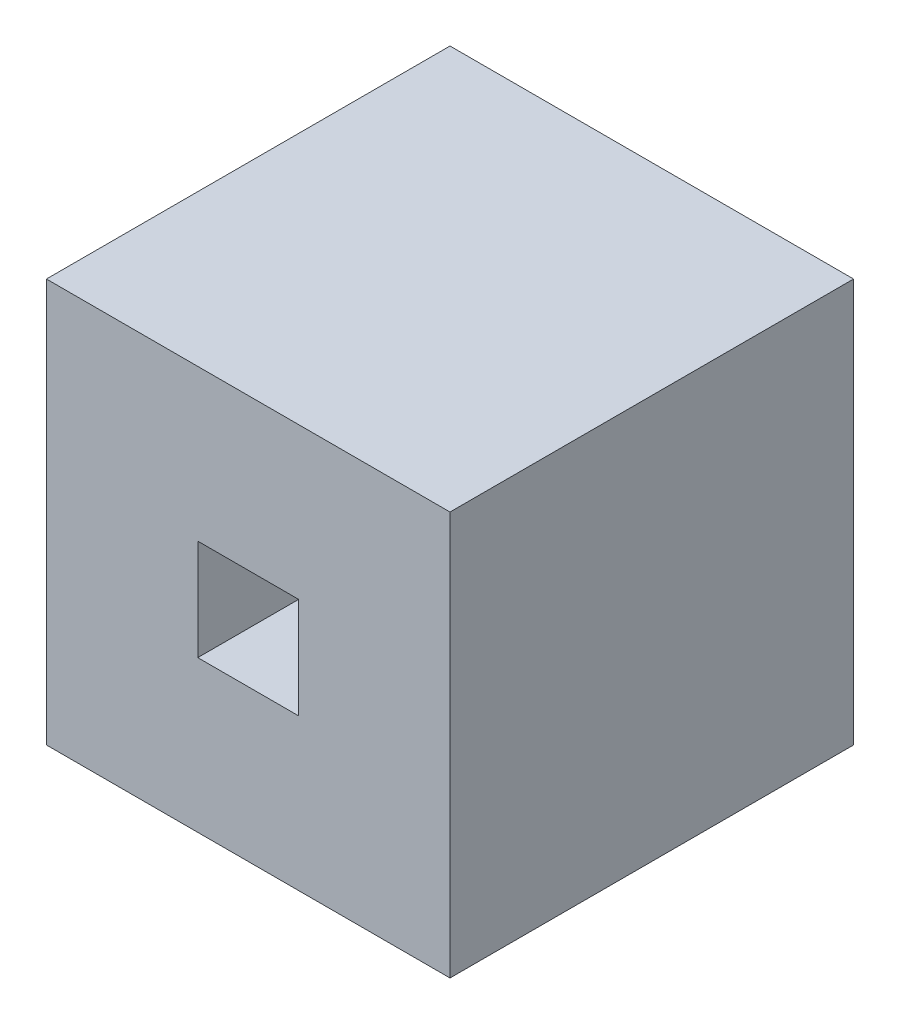
ISO-10303-21;
HEADER;
FILE_DESCRIPTION(('STEP AP214'),'2;1');
FILE_NAME('part.step','',(''),(''),'','','');
FILE_SCHEMA(('AUTOMOTIVE_DESIGN { 1 0 10303 214 1 1 1 1 }'));
ENDSEC;
DATA;
#1=APPLICATION_CONTEXT('core data for automotive mechanical design processes');
#2=APPLICATION_PROTOCOL_DEFINITION('international standard','automotive_design',2000,#1);
#3=PRODUCT_CONTEXT('',#1,'mechanical');
#4=PRODUCT('Part','Part','',(#3));
#5=PRODUCT_RELATED_PRODUCT_CATEGORY('part','',(#4));
#6=PRODUCT_DEFINITION_FORMATION('','',#4);
#7=PRODUCT_DEFINITION_CONTEXT('part definition',#1,'design');
#8=PRODUCT_DEFINITION('design','',#6,#7);
#9=PRODUCT_DEFINITION_SHAPE('','',#8);
#10=(LENGTH_UNIT() NAMED_UNIT(*) SI_UNIT(.MILLI.,.METRE.));
#11=(NAMED_UNIT(*) PLANE_ANGLE_UNIT() SI_UNIT($,.RADIAN.));
#12=(NAMED_UNIT(*) SI_UNIT($,.STERADIAN.) SOLID_ANGLE_UNIT());
#13=UNCERTAINTY_MEASURE_WITH_UNIT(LENGTH_MEASURE(1.E-05),#10,'distance_accuracy_value','');
#14=(GEOMETRIC_REPRESENTATION_CONTEXT(3) GLOBAL_UNCERTAINTY_ASSIGNED_CONTEXT((#13)) GLOBAL_UNIT_ASSIGNED_CONTEXT((#10,
#11,#12)) REPRESENTATION_CONTEXT('',''));
#15=CARTESIAN_POINT('',(0.,0.,0.));
#16=DIRECTION('',(0.,0.,1.));
#17=DIRECTION('',(1.,0.,0.));
#18=AXIS2_PLACEMENT_3D('',#15,#16,#17);
#19=CARTESIAN_POINT('',(-0.3,0.3,2.4));
#20=DIRECTION('',(-1.,0.,0.));
#21=DIRECTION('',(0.,0.,1.));
#22=AXIS2_PLACEMENT_3D('',#19,#20,#21);
#23=PLANE('',#22);
#24=DIRECTION('',(0.,0.,-1.));
#25=VECTOR('',#24,1.);
#26=CARTESIAN_POINT('',(-0.3,0.3,2.4));
#27=LINE('',#26,#25);
#28=CARTESIAN_POINT('',(-0.3,0.3,2.4));
#29=VERTEX_POINT('',#28);
#30=CARTESIAN_POINT('',(-0.3,0.3,0.));
#31=VERTEX_POINT('',#30);
#32=EDGE_CURVE('E11',#29,#31,#27,.T.);
#33=ORIENTED_EDGE('',*,*,#32,.F.);
#34=DIRECTION('',(0.,-1.,0.));
#35=VECTOR('',#34,1.);
#36=CARTESIAN_POINT('',(-0.3,0.3,2.4));
#37=LINE('',#36,#35);
#38=CARTESIAN_POINT('',(-0.3,-0.3,2.4));
#39=VERTEX_POINT('',#38);
#40=EDGE_CURVE('E110',#29,#39,#37,.T.);
#41=ORIENTED_EDGE('',*,*,#40,.T.);
#42=DIRECTION('',(0.,0.,-1.));
#43=VECTOR('',#42,1.);
#44=CARTESIAN_POINT('',(-0.3,-0.3,2.4));
#45=LINE('',#44,#43);
#46=CARTESIAN_POINT('',(-0.3,-0.3,0.));
#47=VERTEX_POINT('',#46);
#48=EDGE_CURVE('E182',#39,#47,#45,.T.);
#49=ORIENTED_EDGE('',*,*,#48,.T.);
#50=DIRECTION('',(0.,-1.,0.));
#51=VECTOR('',#50,1.);
#52=CARTESIAN_POINT('',(-0.3,0.3,0.));
#53=LINE('',#52,#51);
#54=EDGE_CURVE('E136',#31,#47,#53,.T.);
#55=ORIENTED_EDGE('',*,*,#54,.F.);
#56=EDGE_LOOP('',(#33,#41,#49,#55));
#57=FACE_BOUND('',#56,.T.);
#58=ADVANCED_FACE('F16',(#57),#23,.F.);
#59=CARTESIAN_POINT('',(0.3,0.3,2.4));
#60=DIRECTION('',(0.,1.,0.));
#61=DIRECTION('',(1.,0.,0.));
#62=AXIS2_PLACEMENT_3D('',#59,#60,#61);
#63=PLANE('',#62);
#64=DIRECTION('',(0.,0.,-1.));
#65=VECTOR('',#64,1.);
#66=CARTESIAN_POINT('',(0.3,0.3,2.4));
#67=LINE('',#66,#65);
#68=CARTESIAN_POINT('',(0.3,0.3,2.4));
#69=VERTEX_POINT('',#68);
#70=CARTESIAN_POINT('',(0.3,0.3,0.));
#71=VERTEX_POINT('',#70);
#72=EDGE_CURVE('E27',#69,#71,#67,.T.);
#73=ORIENTED_EDGE('',*,*,#72,.F.);
#74=DIRECTION('',(-1.,0.,0.));
#75=VECTOR('',#74,1.);
#76=CARTESIAN_POINT('',(0.3,0.3,2.4));
#77=LINE('',#76,#75);
#78=EDGE_CURVE('E171',#69,#29,#77,.T.);
#79=ORIENTED_EDGE('',*,*,#78,.T.);
#80=ORIENTED_EDGE('',*,*,#32,.T.);
#81=DIRECTION('',(-1.,0.,0.));
#82=VECTOR('',#81,1.);
#83=CARTESIAN_POINT('',(0.3,0.3,0.));
#84=LINE('',#83,#82);
#85=EDGE_CURVE('E20',#71,#31,#84,.T.);
#86=ORIENTED_EDGE('',*,*,#85,.F.);
#87=EDGE_LOOP('',(#73,#79,#80,#86));
#88=FACE_BOUND('',#87,.T.);
#89=ADVANCED_FACE('F208',(#88),#63,.F.);
#90=CARTESIAN_POINT('',(0.3,-0.3,2.4));
#91=DIRECTION('',(1.,0.,0.));
#92=DIRECTION('',(0.,1.,0.));
#93=AXIS2_PLACEMENT_3D('',#90,#91,#92);
#94=PLANE('',#93);
#95=DIRECTION('',(0.,0.,-1.));
#96=VECTOR('',#95,1.);
#97=CARTESIAN_POINT('',(0.3,-0.3,2.4));
#98=LINE('',#97,#96);
#99=CARTESIAN_POINT('',(0.3,-0.3,2.4));
#100=VERTEX_POINT('',#99);
#101=CARTESIAN_POINT('',(0.3,-0.3,0.));
#102=VERTEX_POINT('',#101);
#103=EDGE_CURVE('E40',#100,#102,#98,.T.);
#104=ORIENTED_EDGE('',*,*,#103,.F.);
#105=DIRECTION('',(0.,1.,0.));
#106=VECTOR('',#105,1.);
#107=CARTESIAN_POINT('',(0.3,-0.3,2.4));
#108=LINE('',#107,#106);
#109=EDGE_CURVE('E168',#100,#69,#108,.T.);
#110=ORIENTED_EDGE('',*,*,#109,.T.);
#111=ORIENTED_EDGE('',*,*,#72,.T.);
#112=DIRECTION('',(0.,1.,0.));
#113=VECTOR('',#112,1.);
#114=CARTESIAN_POINT('',(0.3,-0.3,0.));
#115=LINE('',#114,#113);
#116=EDGE_CURVE('E173',#102,#71,#115,.T.);
#117=ORIENTED_EDGE('',*,*,#116,.F.);
#118=EDGE_LOOP('',(#104,#110,#111,#117));
#119=FACE_BOUND('',#118,.T.);
#120=ADVANCED_FACE('F204',(#119),#94,.F.);
#121=CARTESIAN_POINT('',(-0.3,-0.3,2.4));
#122=DIRECTION('',(0.,-1.,0.));
#123=DIRECTION('',(0.,0.,-1.));
#124=AXIS2_PLACEMENT_3D('',#121,#122,#123);
#125=PLANE('',#124);
#126=ORIENTED_EDGE('',*,*,#48,.F.);
#127=DIRECTION('',(1.,0.,0.));
#128=VECTOR('',#127,1.);
#129=CARTESIAN_POINT('',(-0.3,-0.3,2.4));
#130=LINE('',#129,#128);
#131=EDGE_CURVE('E170',#39,#100,#130,.T.);
#132=ORIENTED_EDGE('',*,*,#131,.T.);
#133=ORIENTED_EDGE('',*,*,#103,.T.);
#134=DIRECTION('',(1.,0.,0.));
#135=VECTOR('',#134,1.);
#136=CARTESIAN_POINT('',(-0.3,-0.3,0.));
#137=LINE('',#136,#135);
#138=EDGE_CURVE('E127',#47,#102,#137,.T.);
#139=ORIENTED_EDGE('',*,*,#138,.F.);
#140=EDGE_LOOP('',(#126,#132,#133,#139));
#141=FACE_BOUND('',#140,.T.);
#142=ADVANCED_FACE('F198',(#141),#125,.F.);
#143=CARTESIAN_POINT('',(0.,0.,2.4));
#144=DIRECTION('',(0.,0.,1.));
#145=DIRECTION('',(1.,0.,0.));
#146=AXIS2_PLACEMENT_3D('',#143,#144,#145);
#147=PLANE('',#146);
#148=ORIENTED_EDGE('',*,*,#40,.F.);
#149=ORIENTED_EDGE('',*,*,#78,.F.);
#150=ORIENTED_EDGE('',*,*,#109,.F.);
#151=ORIENTED_EDGE('',*,*,#131,.F.);
#152=EDGE_LOOP('',(#148,#149,#150,#151));
#153=FACE_BOUND('',#152,.T.);
#154=DIRECTION('',(1.,0.,0.));
#155=VECTOR('',#154,1.);
#156=CARTESIAN_POINT('',(-1.2,-1.2,2.4));
#157=LINE('',#156,#155);
#158=CARTESIAN_POINT('',(-1.2,-1.2,2.4));
#159=VERTEX_POINT('',#158);
#160=CARTESIAN_POINT('',(1.2,-1.2,2.4));
#161=VERTEX_POINT('',#160);
#162=EDGE_CURVE('E99',#159,#161,#157,.T.);
#163=ORIENTED_EDGE('',*,*,#162,.T.);
#164=DIRECTION('',(0.,1.,0.));
#165=VECTOR('',#164,1.);
#166=CARTESIAN_POINT('',(1.2,-1.2,2.4));
#167=LINE('',#166,#165);
#168=CARTESIAN_POINT('',(1.2,1.2,2.4));
#169=VERTEX_POINT('',#168);
#170=EDGE_CURVE('E144',#161,#169,#167,.T.);
#171=ORIENTED_EDGE('',*,*,#170,.T.);
#172=DIRECTION('',(-1.,0.,0.));
#173=VECTOR('',#172,1.);
#174=CARTESIAN_POINT('',(1.2,1.2,2.4));
#175=LINE('',#174,#173);
#176=CARTESIAN_POINT('',(-1.2,1.2,2.4));
#177=VERTEX_POINT('',#176);
#178=EDGE_CURVE('E116',#169,#177,#175,.T.);
#179=ORIENTED_EDGE('',*,*,#178,.T.);
#180=DIRECTION('',(0.,-1.,0.));
#181=VECTOR('',#180,1.);
#182=CARTESIAN_POINT('',(-1.2,1.2,2.4));
#183=LINE('',#182,#181);
#184=EDGE_CURVE('E113',#177,#159,#183,.T.);
#185=ORIENTED_EDGE('',*,*,#184,.T.);
#186=EDGE_LOOP('',(#163,#171,#179,#185));
#187=FACE_BOUND('',#186,.T.);
#188=ADVANCED_FACE('F114',(#153,#187),#147,.T.);
#189=CARTESIAN_POINT('',(-1.2,-1.2,0.));
#190=DIRECTION('',(0.,-1.,0.));
#191=DIRECTION('',(0.,0.,-1.));
#192=AXIS2_PLACEMENT_3D('',#189,#190,#191);
#193=PLANE('',#192);
#194=DIRECTION('',(0.,0.,1.));
#195=VECTOR('',#194,1.);
#196=CARTESIAN_POINT('',(1.2,-1.2,0.));
#197=LINE('',#196,#195);
#198=CARTESIAN_POINT('',(1.2,-1.2,0.));
#199=VERTEX_POINT('',#198);
#200=EDGE_CURVE('E106',#199,#161,#197,.T.);
#201=ORIENTED_EDGE('',*,*,#200,.T.);
#202=ORIENTED_EDGE('',*,*,#162,.F.);
#203=DIRECTION('',(0.,0.,1.));
#204=VECTOR('',#203,1.);
#205=CARTESIAN_POINT('',(-1.2,-1.2,0.));
#206=LINE('',#205,#204);
#207=CARTESIAN_POINT('',(-1.2,-1.2,0.));
#208=VERTEX_POINT('',#207);
#209=EDGE_CURVE('E104',#208,#159,#206,.T.);
#210=ORIENTED_EDGE('',*,*,#209,.F.);
#211=DIRECTION('',(1.,0.,0.));
#212=VECTOR('',#211,1.);
#213=CARTESIAN_POINT('',(-1.2,-1.2,0.));
#214=LINE('',#213,#212);
#215=EDGE_CURVE('E145',#208,#199,#214,.T.);
#216=ORIENTED_EDGE('',*,*,#215,.T.);
#217=EDGE_LOOP('',(#201,#202,#210,#216));
#218=FACE_BOUND('',#217,.T.);
#219=ADVANCED_FACE('F101',(#218),#193,.T.);
#220=CARTESIAN_POINT('',(1.2,-1.2,0.));
#221=DIRECTION('',(1.,0.,0.));
#222=DIRECTION('',(0.,1.,0.));
#223=AXIS2_PLACEMENT_3D('',#220,#221,#222);
#224=PLANE('',#223);
#225=DIRECTION('',(0.,0.,1.));
#226=VECTOR('',#225,1.);
#227=CARTESIAN_POINT('',(1.2,1.2,0.));
#228=LINE('',#227,#226);
#229=CARTESIAN_POINT('',(1.2,1.2,0.));
#230=VERTEX_POINT('',#229);
#231=EDGE_CURVE('E148',#230,#169,#228,.T.);
#232=ORIENTED_EDGE('',*,*,#231,.T.);
#233=ORIENTED_EDGE('',*,*,#170,.F.);
#234=ORIENTED_EDGE('',*,*,#200,.F.);
#235=DIRECTION('',(0.,1.,0.));
#236=VECTOR('',#235,1.);
#237=CARTESIAN_POINT('',(1.2,-1.2,0.));
#238=LINE('',#237,#236);
#239=EDGE_CURVE('E147',#199,#230,#238,.T.);
#240=ORIENTED_EDGE('',*,*,#239,.T.);
#241=EDGE_LOOP('',(#232,#233,#234,#240));
#242=FACE_BOUND('',#241,.T.);
#243=ADVANCED_FACE('F440',(#242),#224,.T.);
#244=CARTESIAN_POINT('',(1.2,1.2,0.));
#245=DIRECTION('',(0.,1.,0.));
#246=DIRECTION('',(1.,0.,0.));
#247=AXIS2_PLACEMENT_3D('',#244,#245,#246);
#248=PLANE('',#247);
#249=DIRECTION('',(0.,0.,1.));
#250=VECTOR('',#249,1.);
#251=CARTESIAN_POINT('',(-1.2,1.2,0.));
#252=LINE('',#251,#250);
#253=CARTESIAN_POINT('',(-1.2,1.2,0.));
#254=VERTEX_POINT('',#253);
#255=EDGE_CURVE('E120',#254,#177,#252,.T.);
#256=ORIENTED_EDGE('',*,*,#255,.T.);
#257=ORIENTED_EDGE('',*,*,#178,.F.);
#258=ORIENTED_EDGE('',*,*,#231,.F.);
#259=DIRECTION('',(-1.,0.,0.));
#260=VECTOR('',#259,1.);
#261=CARTESIAN_POINT('',(1.2,1.2,0.));
#262=LINE('',#261,#260);
#263=EDGE_CURVE('E175',#230,#254,#262,.T.);
#264=ORIENTED_EDGE('',*,*,#263,.T.);
#265=EDGE_LOOP('',(#256,#257,#258,#264));
#266=FACE_BOUND('',#265,.T.);
#267=ADVANCED_FACE('F431',(#266),#248,.T.);
#268=CARTESIAN_POINT('',(-1.2,1.2,0.));
#269=DIRECTION('',(-1.,0.,0.));
#270=DIRECTION('',(0.,0.,1.));
#271=AXIS2_PLACEMENT_3D('',#268,#269,#270);
#272=PLANE('',#271);
#273=ORIENTED_EDGE('',*,*,#209,.T.);
#274=ORIENTED_EDGE('',*,*,#184,.F.);
#275=ORIENTED_EDGE('',*,*,#255,.F.);
#276=DIRECTION('',(0.,-1.,0.));
#277=VECTOR('',#276,1.);
#278=CARTESIAN_POINT('',(-1.2,1.2,0.));
#279=LINE('',#278,#277);
#280=EDGE_CURVE('E124',#254,#208,#279,.T.);
#281=ORIENTED_EDGE('',*,*,#280,.T.);
#282=EDGE_LOOP('',(#273,#274,#275,#281));
#283=FACE_BOUND('',#282,.T.);
#284=ADVANCED_FACE('F122',(#283),#272,.T.);
#285=CARTESIAN_POINT('',(0.,0.,0.));
#286=DIRECTION('',(0.,0.,1.));
#287=DIRECTION('',(1.,0.,0.));
#288=AXIS2_PLACEMENT_3D('',#285,#286,#287);
#289=PLANE('',#288);
#290=ORIENTED_EDGE('',*,*,#116,.T.);
#291=ORIENTED_EDGE('',*,*,#85,.T.);
#292=ORIENTED_EDGE('',*,*,#54,.T.);
#293=ORIENTED_EDGE('',*,*,#138,.T.);
#294=EDGE_LOOP('',(#290,#291,#292,#293));
#295=FACE_BOUND('',#294,.T.);
#296=ORIENTED_EDGE('',*,*,#263,.F.);
#297=ORIENTED_EDGE('',*,*,#239,.F.);
#298=ORIENTED_EDGE('',*,*,#215,.F.);
#299=ORIENTED_EDGE('',*,*,#280,.F.);
#300=EDGE_LOOP('',(#296,#297,#298,#299));
#301=FACE_BOUND('',#300,.T.);
#302=ADVANCED_FACE('F18',(#295,#301),#289,.F.);
#303=CLOSED_SHELL('',(#58,#89,#120,#142,#188,#219,#243,#267,#284,#302));
#304=MANIFOLD_SOLID_BREP('B1',#303);
#305=ADVANCED_BREP_SHAPE_REPRESENTATION('',(#18,#304),#14);
#306=SHAPE_DEFINITION_REPRESENTATION(#9,#305);
ENDSEC;
END-ISO-10303-21;
